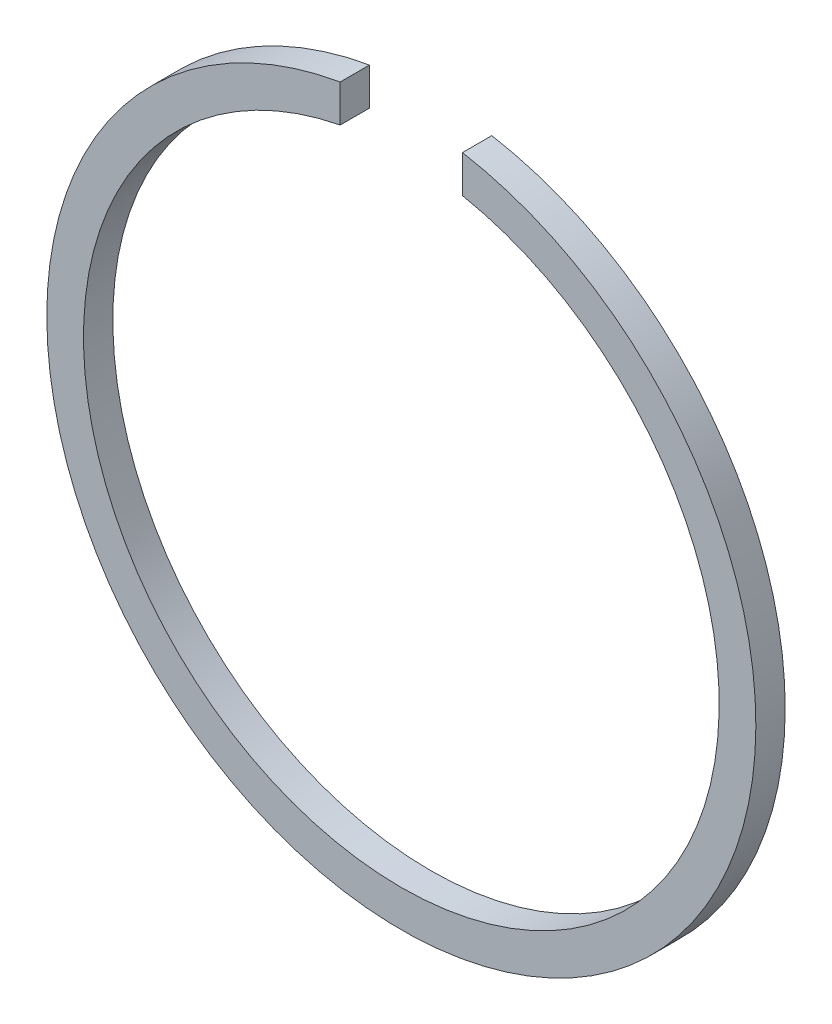
ISO-10303-21;
HEADER;
FILE_DESCRIPTION(('STEP AP214'),'2;1');
FILE_NAME('part.step','',(''),(''),'','','');
FILE_SCHEMA(('AUTOMOTIVE_DESIGN { 1 0 10303 214 1 1 1 1 }'));
ENDSEC;
DATA;
#1=APPLICATION_CONTEXT('core data for automotive mechanical design processes');
#2=APPLICATION_PROTOCOL_DEFINITION('international standard','automotive_design',2000,#1);
#3=PRODUCT_CONTEXT('',#1,'mechanical');
#4=PRODUCT('Part','Part','',(#3));
#5=PRODUCT_RELATED_PRODUCT_CATEGORY('part','',(#4));
#6=PRODUCT_DEFINITION_FORMATION('','',#4);
#7=PRODUCT_DEFINITION_CONTEXT('part definition',#1,'design');
#8=PRODUCT_DEFINITION('design','',#6,#7);
#9=PRODUCT_DEFINITION_SHAPE('','',#8);
#10=(LENGTH_UNIT() NAMED_UNIT(*) SI_UNIT(.MILLI.,.METRE.));
#11=(NAMED_UNIT(*) PLANE_ANGLE_UNIT() SI_UNIT($,.RADIAN.));
#12=(NAMED_UNIT(*) SI_UNIT($,.STERADIAN.) SOLID_ANGLE_UNIT());
#13=UNCERTAINTY_MEASURE_WITH_UNIT(LENGTH_MEASURE(1.E-05),#10,'distance_accuracy_value','');
#14=(GEOMETRIC_REPRESENTATION_CONTEXT(3) GLOBAL_UNCERTAINTY_ASSIGNED_CONTEXT((#13)) GLOBAL_UNIT_ASSIGNED_CONTEXT((#10,
#11,#12)) REPRESENTATION_CONTEXT('',''));
#15=CARTESIAN_POINT('',(0.,0.,0.));
#16=DIRECTION('',(0.,0.,1.));
#17=DIRECTION('',(1.,0.,0.));
#18=AXIS2_PLACEMENT_3D('',#15,#16,#17);
#19=CARTESIAN_POINT('',(0.,0.,1.2));
#20=DIRECTION('',(0.,0.,-1.));
#21=DIRECTION('',(-1.,0.,0.));
#22=AXIS2_PLACEMENT_3D('',#19,#20,#21);
#23=CYLINDRICAL_SURFACE('',#22,13.);
#24=CARTESIAN_POINT('',(0.,0.,0.));
#25=DIRECTION('',(0.,0.,-1.));
#26=DIRECTION('',(1.,0.,0.));
#27=AXIS2_PLACEMENT_3D('',#24,#25,#26);
#28=CIRCLE('',#27,13.);
#29=CARTESIAN_POINT('',(2.5,12.7573508221731,0.));
#30=VERTEX_POINT('',#29);
#31=CARTESIAN_POINT('',(-2.5,12.7573508221731,0.));
#32=VERTEX_POINT('',#31);
#33=EDGE_CURVE('E107',#30,#32,#28,.T.);
#34=ORIENTED_EDGE('',*,*,#33,.T.);
#35=DIRECTION('',(0.,0.,-1.));
#36=VECTOR('',#35,1.);
#37=CARTESIAN_POINT('',(-2.5,12.7573508221731,1.2));
#38=LINE('',#37,#36);
#39=CARTESIAN_POINT('',(-2.5,12.7573508221731,1.2));
#40=VERTEX_POINT('',#39);
#41=EDGE_CURVE('E11',#40,#32,#38,.T.);
#42=ORIENTED_EDGE('',*,*,#41,.F.);
#43=CARTESIAN_POINT('',(0.,0.,1.2));
#44=DIRECTION('',(0.,0.,-1.));
#45=DIRECTION('',(1.,0.,0.));
#46=AXIS2_PLACEMENT_3D('',#43,#44,#45);
#47=CIRCLE('',#46,13.);
#48=CARTESIAN_POINT('',(2.5,12.7573508221731,1.2));
#49=VERTEX_POINT('',#48);
#50=EDGE_CURVE('E91',#49,#40,#47,.T.);
#51=ORIENTED_EDGE('',*,*,#50,.F.);
#52=DIRECTION('',(0.,0.,-1.));
#53=VECTOR('',#52,1.);
#54=CARTESIAN_POINT('',(2.5,12.7573508221731,1.2));
#55=LINE('',#54,#53);
#56=EDGE_CURVE('E103',#49,#30,#55,.T.);
#57=ORIENTED_EDGE('',*,*,#56,.T.);
#58=EDGE_LOOP('',(#34,#42,#51,#57));
#59=FACE_BOUND('',#58,.T.);
#60=ADVANCED_FACE('F39',(#59),#23,.F.);
#61=CARTESIAN_POINT('',(-2.5,12.7573508221731,1.2));
#62=DIRECTION('',(-1.,0.,0.));
#63=DIRECTION('',(0.,-1.,0.));
#64=AXIS2_PLACEMENT_3D('',#61,#62,#63);
#65=PLANE('',#64);
#66=DIRECTION('',(0.,1.,0.));
#67=VECTOR('',#66,1.);
#68=CARTESIAN_POINT('',(-2.5,12.7573508221731,0.));
#69=LINE('',#68,#67);
#70=CARTESIAN_POINT('',(-2.5,14.2828568570857,0.));
#71=VERTEX_POINT('',#70);
#72=EDGE_CURVE('E96',#32,#71,#69,.T.);
#73=ORIENTED_EDGE('',*,*,#72,.T.);
#74=DIRECTION('',(0.,0.,-1.));
#75=VECTOR('',#74,1.);
#76=CARTESIAN_POINT('',(-2.5,14.2828568570857,1.2));
#77=LINE('',#76,#75);
#78=CARTESIAN_POINT('',(-2.5,14.2828568570857,1.2));
#79=VERTEX_POINT('',#78);
#80=EDGE_CURVE('E48',#79,#71,#77,.T.);
#81=ORIENTED_EDGE('',*,*,#80,.F.);
#82=DIRECTION('',(0.,1.,0.));
#83=VECTOR('',#82,1.);
#84=CARTESIAN_POINT('',(-2.5,12.7573508221731,1.2));
#85=LINE('',#84,#83);
#86=EDGE_CURVE('E86',#40,#79,#85,.T.);
#87=ORIENTED_EDGE('',*,*,#86,.F.);
#88=ORIENTED_EDGE('',*,*,#41,.T.);
#89=EDGE_LOOP('',(#73,#81,#87,#88));
#90=FACE_BOUND('',#89,.T.);
#91=ADVANCED_FACE('F95',(#90),#65,.F.);
#92=CARTESIAN_POINT('',(0.,0.,1.2));
#93=DIRECTION('',(0.,0.,-1.));
#94=DIRECTION('',(-1.,0.,0.));
#95=AXIS2_PLACEMENT_3D('',#92,#93,#94);
#96=CYLINDRICAL_SURFACE('',#95,14.5);
#97=CARTESIAN_POINT('',(0.,0.,0.));
#98=DIRECTION('',(0.,0.,1.));
#99=DIRECTION('',(1.,0.,0.));
#100=AXIS2_PLACEMENT_3D('',#97,#98,#99);
#101=CIRCLE('',#100,14.5);
#102=CARTESIAN_POINT('',(2.5,14.2828568570857,0.));
#103=VERTEX_POINT('',#102);
#104=EDGE_CURVE('E73',#71,#103,#101,.T.);
#105=ORIENTED_EDGE('',*,*,#104,.T.);
#106=DIRECTION('',(0.,0.,-1.));
#107=VECTOR('',#106,1.);
#108=CARTESIAN_POINT('',(2.5,14.2828568570857,1.2));
#109=LINE('',#108,#107);
#110=CARTESIAN_POINT('',(2.5,14.2828568570857,1.2));
#111=VERTEX_POINT('',#110);
#112=EDGE_CURVE('E98',#111,#103,#109,.T.);
#113=ORIENTED_EDGE('',*,*,#112,.F.);
#114=CARTESIAN_POINT('',(0.,0.,1.2));
#115=DIRECTION('',(0.,0.,1.));
#116=DIRECTION('',(1.,0.,0.));
#117=AXIS2_PLACEMENT_3D('',#114,#115,#116);
#118=CIRCLE('',#117,14.5);
#119=EDGE_CURVE('E89',#79,#111,#118,.T.);
#120=ORIENTED_EDGE('',*,*,#119,.F.);
#121=ORIENTED_EDGE('',*,*,#80,.T.);
#122=EDGE_LOOP('',(#105,#113,#120,#121));
#123=FACE_BOUND('',#122,.T.);
#124=ADVANCED_FACE('F99',(#123),#96,.T.);
#125=CARTESIAN_POINT('',(2.5,12.7573508221731,1.2));
#126=DIRECTION('',(1.,0.,0.));
#127=DIRECTION('',(0.,1.,0.));
#128=AXIS2_PLACEMENT_3D('',#125,#126,#127);
#129=PLANE('',#128);
#130=DIRECTION('',(0.,-1.,0.));
#131=VECTOR('',#130,1.);
#132=CARTESIAN_POINT('',(2.5,12.7573508221731,0.));
#133=LINE('',#132,#131);
#134=EDGE_CURVE('E79',#103,#30,#133,.T.);
#135=ORIENTED_EDGE('',*,*,#134,.T.);
#136=ORIENTED_EDGE('',*,*,#56,.F.);
#137=DIRECTION('',(0.,-1.,0.));
#138=VECTOR('',#137,1.);
#139=CARTESIAN_POINT('',(2.5,12.7573508221731,1.2));
#140=LINE('',#139,#138);
#141=EDGE_CURVE('E56',#111,#49,#140,.T.);
#142=ORIENTED_EDGE('',*,*,#141,.F.);
#143=ORIENTED_EDGE('',*,*,#112,.T.);
#144=EDGE_LOOP('',(#135,#136,#142,#143));
#145=FACE_BOUND('',#144,.T.);
#146=ADVANCED_FACE('F120',(#145),#129,.F.);
#147=CARTESIAN_POINT('',(0.,0.,1.2));
#148=DIRECTION('',(0.,0.,1.));
#149=DIRECTION('',(1.,0.,0.));
#150=AXIS2_PLACEMENT_3D('',#147,#148,#149);
#151=PLANE('',#150);
#152=ORIENTED_EDGE('',*,*,#50,.T.);
#153=ORIENTED_EDGE('',*,*,#86,.T.);
#154=ORIENTED_EDGE('',*,*,#119,.T.);
#155=ORIENTED_EDGE('',*,*,#141,.T.);
#156=EDGE_LOOP('',(#152,#153,#154,#155));
#157=FACE_BOUND('',#156,.T.);
#158=ADVANCED_FACE('F87',(#157),#151,.T.);
#159=CARTESIAN_POINT('',(0.,0.,0.));
#160=DIRECTION('',(0.,0.,1.));
#161=DIRECTION('',(1.,0.,0.));
#162=AXIS2_PLACEMENT_3D('',#159,#160,#161);
#163=PLANE('',#162);
#164=ORIENTED_EDGE('',*,*,#33,.F.);
#165=ORIENTED_EDGE('',*,*,#134,.F.);
#166=ORIENTED_EDGE('',*,*,#104,.F.);
#167=ORIENTED_EDGE('',*,*,#72,.F.);
#168=EDGE_LOOP('',(#164,#165,#166,#167));
#169=FACE_BOUND('',#168,.T.);
#170=ADVANCED_FACE('F123',(#169),#163,.F.);
#171=CLOSED_SHELL('',(#60,#91,#124,#146,#158,#170));
#172=MANIFOLD_SOLID_BREP('B2',#171);
#173=ADVANCED_BREP_SHAPE_REPRESENTATION('',(#18,#172),#14);
#174=SHAPE_DEFINITION_REPRESENTATION(#9,#173);
ENDSEC;
END-ISO-10303-21;
